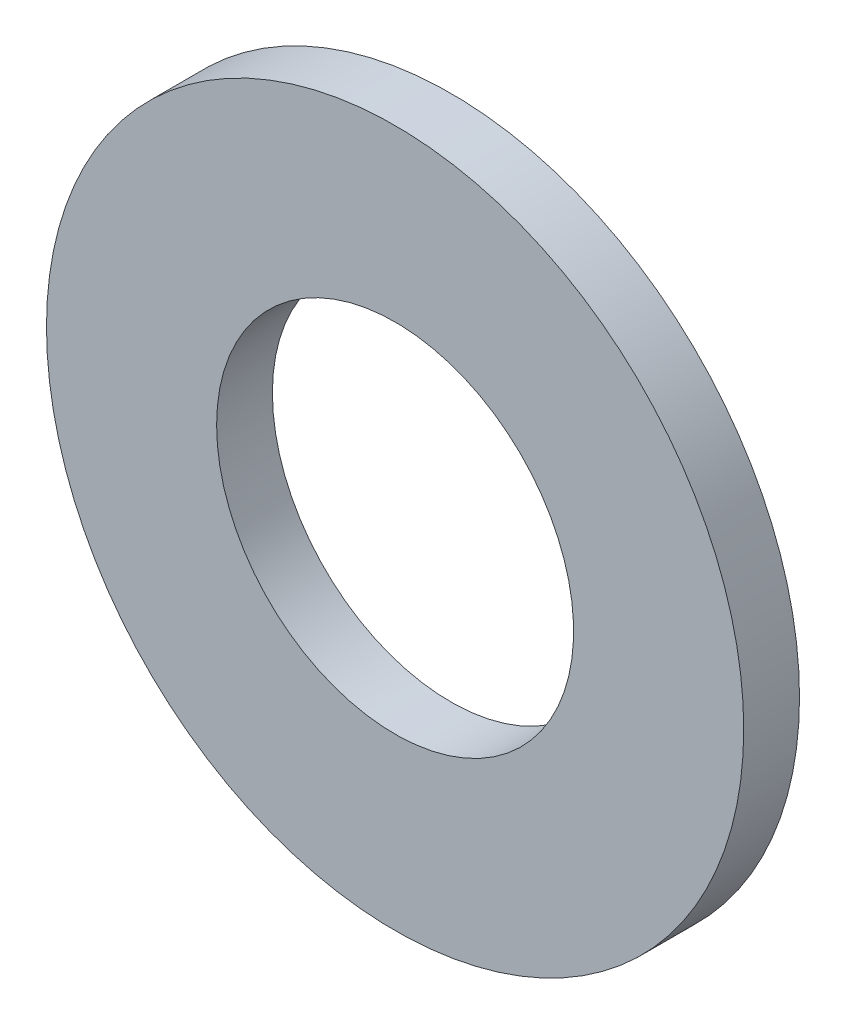
ISO-10303-21;
HEADER;
FILE_DESCRIPTION(('STEP AP214'),'2;1');
FILE_NAME('part.step','',(''),(''),'','','');
FILE_SCHEMA(('AUTOMOTIVE_DESIGN { 1 0 10303 214 1 1 1 1 }'));
ENDSEC;
DATA;
#1=APPLICATION_CONTEXT('core data for automotive mechanical design processes');
#2=APPLICATION_PROTOCOL_DEFINITION('international standard','automotive_design',2000,#1);
#3=PRODUCT_CONTEXT('',#1,'mechanical');
#4=PRODUCT('Part','Part','',(#3));
#5=PRODUCT_RELATED_PRODUCT_CATEGORY('part','',(#4));
#6=PRODUCT_DEFINITION_FORMATION('','',#4);
#7=PRODUCT_DEFINITION_CONTEXT('part definition',#1,'design');
#8=PRODUCT_DEFINITION('design','',#6,#7);
#9=PRODUCT_DEFINITION_SHAPE('','',#8);
#10=(LENGTH_UNIT() NAMED_UNIT(*) SI_UNIT(.MILLI.,.METRE.));
#11=(NAMED_UNIT(*) PLANE_ANGLE_UNIT() SI_UNIT($,.RADIAN.));
#12=(NAMED_UNIT(*) SI_UNIT($,.STERADIAN.) SOLID_ANGLE_UNIT());
#13=UNCERTAINTY_MEASURE_WITH_UNIT(LENGTH_MEASURE(1.E-05),#10,'distance_accuracy_value','');
#14=(GEOMETRIC_REPRESENTATION_CONTEXT(3) GLOBAL_UNCERTAINTY_ASSIGNED_CONTEXT((#13)) GLOBAL_UNIT_ASSIGNED_CONTEXT((#10,
#11,#12)) REPRESENTATION_CONTEXT('',''));
#15=CARTESIAN_POINT('',(0.,0.,0.));
#16=DIRECTION('',(0.,0.,1.));
#17=DIRECTION('',(1.,0.,0.));
#18=AXIS2_PLACEMENT_3D('',#15,#16,#17);
#19=CARTESIAN_POINT('',(0.,0.,1.));
#20=DIRECTION('',(0.,0.,0.999999999999998));
#21=DIRECTION('',(1.,0.,0.));
#22=AXIS2_PLACEMENT_3D('',#19,#20,#21);
#23=PLANE('',#22);
#24=CARTESIAN_POINT('',(0.,0.,1.));
#25=DIRECTION('',(0.,0.,0.999999999999998));
#26=DIRECTION('',(1.,0.,0.));
#27=AXIS2_PLACEMENT_3D('',#24,#25,#26);
#28=CIRCLE('',#27,6.25);
#29=CARTESIAN_POINT('',(-6.25,0.,0.999999999999998));
#30=VERTEX_POINT('',#29);
#31=EDGE_CURVE('E10',#30,#30,#28,.T.);
#32=ORIENTED_EDGE('',*,*,#31,.T.);
#33=EDGE_LOOP('',(#32));
#34=FACE_BOUND('',#33,.T.);
#35=CARTESIAN_POINT('',(0.,0.,1.));
#36=DIRECTION('',(0.,0.,0.999999999999998));
#37=DIRECTION('',(1.,0.,0.));
#38=AXIS2_PLACEMENT_3D('',#35,#36,#37);
#39=CIRCLE('',#38,3.2);
#40=CARTESIAN_POINT('',(-3.2,0.,0.999999999999999));
#41=VERTEX_POINT('',#40);
#42=EDGE_CURVE('E39',#41,#41,#39,.T.);
#43=ORIENTED_EDGE('',*,*,#42,.F.);
#44=EDGE_LOOP('',(#43));
#45=FACE_BOUND('',#44,.T.);
#46=ADVANCED_FACE('F28',(#34,#45),#23,.T.);
#47=CARTESIAN_POINT('',(0.,0.,0.));
#48=DIRECTION('',(0.,0.,0.999999999999998));
#49=DIRECTION('',(1.,0.,0.));
#50=AXIS2_PLACEMENT_3D('',#47,#48,#49);
#51=PLANE('',#50);
#52=CARTESIAN_POINT('',(0.,0.,0.));
#53=DIRECTION('',(0.,0.,0.999999999999998));
#54=DIRECTION('',(1.,0.,0.));
#55=AXIS2_PLACEMENT_3D('',#52,#53,#54);
#56=CIRCLE('',#55,6.25);
#57=CARTESIAN_POINT('',(-6.25,0.,0.));
#58=VERTEX_POINT('',#57);
#59=EDGE_CURVE('E32',#58,#58,#56,.T.);
#60=ORIENTED_EDGE('',*,*,#59,.F.);
#61=EDGE_LOOP('',(#60));
#62=FACE_BOUND('',#61,.T.);
#63=CARTESIAN_POINT('',(0.,0.,0.));
#64=DIRECTION('',(0.,0.,0.999999999999998));
#65=DIRECTION('',(1.,0.,0.));
#66=AXIS2_PLACEMENT_3D('',#63,#64,#65);
#67=CIRCLE('',#66,3.2);
#68=CARTESIAN_POINT('',(-3.2,0.,0.));
#69=VERTEX_POINT('',#68);
#70=EDGE_CURVE('E41',#69,#69,#67,.T.);
#71=ORIENTED_EDGE('',*,*,#70,.T.);
#72=EDGE_LOOP('',(#71));
#73=FACE_BOUND('',#72,.T.);
#74=ADVANCED_FACE('F51',(#62,#73),#51,.F.);
#75=CARTESIAN_POINT('',(0.,0.,1.));
#76=DIRECTION('',(0.,0.,-0.999999999999998));
#77=DIRECTION('',(-1.,0.,0.));
#78=AXIS2_PLACEMENT_3D('',#75,#76,#77);
#79=CYLINDRICAL_SURFACE('',#78,6.25);
#80=CARTESIAN_POINT('',(-6.25,0.,0.999999999999998));
#81=CARTESIAN_POINT('',(-6.25,0.,0.989583333333331));
#82=CARTESIAN_POINT('',(-6.25,0.,0.979166666666665));
#83=CARTESIAN_POINT('',(-6.25,0.,0.958333333333331));
#84=CARTESIAN_POINT('',(-6.25,0.,0.947916666666665));
#85=CARTESIAN_POINT('',(-6.25,0.,0.927083333333331));
#86=CARTESIAN_POINT('',(-6.25,0.,0.916666666666665));
#87=CARTESIAN_POINT('',(-6.25,0.,0.895833333333331));
#88=CARTESIAN_POINT('',(-6.25,0.,0.885416666666665));
#89=CARTESIAN_POINT('',(-6.25,0.,0.864583333333331));
#90=CARTESIAN_POINT('',(-6.25,0.,0.854166666666665));
#91=CARTESIAN_POINT('',(-6.25,0.,0.833333333333331));
#92=CARTESIAN_POINT('',(-6.25,0.,0.822916666666665));
#93=CARTESIAN_POINT('',(-6.25,0.,0.802083333333331));
#94=CARTESIAN_POINT('',(-6.25,0.,0.791666666666665));
#95=CARTESIAN_POINT('',(-6.25,0.,0.770833333333331));
#96=CARTESIAN_POINT('',(-6.25,0.,0.760416666666664));
#97=CARTESIAN_POINT('',(-6.25,0.,0.739583333333331));
#98=CARTESIAN_POINT('',(-6.25,0.,0.729166666666664));
#99=CARTESIAN_POINT('',(-6.25,0.,0.708333333333331));
#100=CARTESIAN_POINT('',(-6.25,0.,0.697916666666664));
#101=CARTESIAN_POINT('',(-6.25,0.,0.677083333333331));
#102=CARTESIAN_POINT('',(-6.25,0.,0.666666666666664));
#103=CARTESIAN_POINT('',(-6.25,0.,0.645833333333331));
#104=CARTESIAN_POINT('',(-6.25,0.,0.635416666666664));
#105=CARTESIAN_POINT('',(-6.25,0.,0.614583333333331));
#106=CARTESIAN_POINT('',(-6.25,0.,0.604166666666664));
#107=CARTESIAN_POINT('',(-6.25,0.,0.583333333333331));
#108=CARTESIAN_POINT('',(-6.25,0.,0.572916666666664));
#109=CARTESIAN_POINT('',(-6.25,0.,0.552083333333331));
#110=CARTESIAN_POINT('',(-6.25,0.,0.541666666666664));
#111=CARTESIAN_POINT('',(-6.25,0.,0.520833333333331));
#112=CARTESIAN_POINT('',(-6.25,0.,0.510416666666664));
#113=CARTESIAN_POINT('',(-6.25,0.,0.489583333333331));
#114=CARTESIAN_POINT('',(-6.25,0.,0.479166666666664));
#115=CARTESIAN_POINT('',(-6.25,0.,0.458333333333331));
#116=CARTESIAN_POINT('',(-6.25,0.,0.447916666666664));
#117=CARTESIAN_POINT('',(-6.25,0.,0.427083333333331));
#118=CARTESIAN_POINT('',(-6.25,0.,0.416666666666664));
#119=CARTESIAN_POINT('',(-6.25,0.,0.395833333333331));
#120=CARTESIAN_POINT('',(-6.25,0.,0.385416666666664));
#121=CARTESIAN_POINT('',(-6.25,0.,0.364583333333331));
#122=CARTESIAN_POINT('',(-6.25,0.,0.354166666666664));
#123=CARTESIAN_POINT('',(-6.25,0.,0.333333333333331));
#124=CARTESIAN_POINT('',(-6.25,0.,0.322916666666664));
#125=CARTESIAN_POINT('',(-6.25,0.,0.302083333333331));
#126=CARTESIAN_POINT('',(-6.25,0.,0.291666666666664));
#127=CARTESIAN_POINT('',(-6.25,0.,0.270833333333331));
#128=CARTESIAN_POINT('',(-6.25,0.,0.260416666666664));
#129=CARTESIAN_POINT('',(-6.25,0.,0.239583333333331));
#130=CARTESIAN_POINT('',(-6.25,0.,0.229166666666664));
#131=CARTESIAN_POINT('',(-6.25,0.,0.208333333333331));
#132=CARTESIAN_POINT('',(-6.25,0.,0.197916666666664));
#133=CARTESIAN_POINT('',(-6.25,0.,0.177083333333331));
#134=CARTESIAN_POINT('',(-6.25,0.,0.166666666666664));
#135=CARTESIAN_POINT('',(-6.25,0.,0.145833333333331));
#136=CARTESIAN_POINT('',(-6.25,0.,0.135416666666664));
#137=CARTESIAN_POINT('',(-6.25,0.,0.114583333333331));
#138=CARTESIAN_POINT('',(-6.25,0.,0.104166666666664));
#139=CARTESIAN_POINT('',(-6.25,0.,0.0833333333333306));
#140=CARTESIAN_POINT('',(-6.25,0.,0.0729166666666638));
#141=CARTESIAN_POINT('',(-6.25,0.,0.0520833333333305));
#142=CARTESIAN_POINT('',(-6.25,0.,0.0416666666666638));
#143=CARTESIAN_POINT('',(-6.25,0.,0.0208333333333305));
#144=CARTESIAN_POINT('',(-6.25,0.,0.0104166666666638));
#145=CARTESIAN_POINT('',(-6.25,0.,0.));
#146=B_SPLINE_CURVE_WITH_KNOTS('',3,(#80,#81,#82,#83,#84,#85,#86,#87,#88,#89,#90,#91,#92,#93,
#94,#95,#96,#97,#98,#99,#100,#101,#102,#103,#104,#105,#106,#107,#108,#109,#110,#111,#112,#113,
#114,#115,#116,#117,#118,#119,#120,#121,#122,#123,#124,#125,#126,#127,#128,#129,#130,#131,#132,
#133,#134,#135,#136,#137,#138,#139,#140,#141,#142,#143,#144,#145),.UNSPECIFIED.,.F.,.F.,(4,2,2,
2,2,2,2,2,2,2,2,2,2,2,2,2,2,2,2,2,2,2,2,2,2,2,2,2,2,2,2,2,4),(0.,0.0312500000000001,
0.0625000000000002,0.0937500000000002,0.125,0.15625,0.1875,0.21875,0.25,0.28125,0.3125,0.34375,
0.375,0.40625,0.4375,0.46875,0.500000000000001,0.53125,0.562500000000001,0.593750000000001,
0.625000000000001,0.656250000000001,0.687500000000001,0.718750000000001,0.750000000000001,
0.781250000000001,0.812500000000001,0.843750000000001,0.875000000000001,0.906250000000001,
0.937500000000001,0.968750000000001,1.),.UNSPECIFIED.);
#147=EDGE_CURVE('BSEAM30',#30,#58,#146,.T.);
#148=ORIENTED_EDGE('',*,*,#31,.F.);
#149=ORIENTED_EDGE('',*,*,#59,.T.);
#150=ORIENTED_EDGE('',*,*,#147,.T.);
#151=ORIENTED_EDGE('',*,*,#147,.F.);
#152=EDGE_LOOP('',(#148,#150,#149,#151));
#153=FACE_BOUND('',#152,.T.);
#154=ADVANCED_FACE('F30',(#153),#79,.T.);
#155=CARTESIAN_POINT('',(0.,0.,1.));
#156=DIRECTION('',(0.,0.,-0.999999999999998));
#157=DIRECTION('',(-1.,0.,0.));
#158=AXIS2_PLACEMENT_3D('',#155,#156,#157);
#159=CYLINDRICAL_SURFACE('',#158,3.2);
#160=CARTESIAN_POINT('',(-3.2,0.,0.999999999999999));
#161=CARTESIAN_POINT('',(-3.2,0.,0.989583333333333));
#162=CARTESIAN_POINT('',(-3.2,0.,0.979166666666666));
#163=CARTESIAN_POINT('',(-3.2,0.,0.958333333333333));
#164=CARTESIAN_POINT('',(-3.2,0.,0.947916666666666));
#165=CARTESIAN_POINT('',(-3.2,0.,0.927083333333333));
#166=CARTESIAN_POINT('',(-3.2,0.,0.916666666666666));
#167=CARTESIAN_POINT('',(-3.2,0.,0.895833333333333));
#168=CARTESIAN_POINT('',(-3.2,0.,0.885416666666666));
#169=CARTESIAN_POINT('',(-3.2,0.,0.864583333333333));
#170=CARTESIAN_POINT('',(-3.2,0.,0.854166666666666));
#171=CARTESIAN_POINT('',(-3.2,0.,0.833333333333333));
#172=CARTESIAN_POINT('',(-3.2,0.,0.822916666666666));
#173=CARTESIAN_POINT('',(-3.2,0.,0.802083333333333));
#174=CARTESIAN_POINT('',(-3.2,0.,0.791666666666666));
#175=CARTESIAN_POINT('',(-3.2,0.,0.770833333333333));
#176=CARTESIAN_POINT('',(-3.2,0.,0.760416666666666));
#177=CARTESIAN_POINT('',(-3.2,0.,0.739583333333333));
#178=CARTESIAN_POINT('',(-3.2,0.,0.729166666666666));
#179=CARTESIAN_POINT('',(-3.2,0.,0.708333333333332));
#180=CARTESIAN_POINT('',(-3.2,0.,0.697916666666666));
#181=CARTESIAN_POINT('',(-3.2,0.,0.677083333333332));
#182=CARTESIAN_POINT('',(-3.2,0.,0.666666666666666));
#183=CARTESIAN_POINT('',(-3.2,0.,0.645833333333332));
#184=CARTESIAN_POINT('',(-3.2,0.,0.635416666666666));
#185=CARTESIAN_POINT('',(-3.2,0.,0.614583333333332));
#186=CARTESIAN_POINT('',(-3.2,0.,0.604166666666666));
#187=CARTESIAN_POINT('',(-3.2,0.,0.583333333333332));
#188=CARTESIAN_POINT('',(-3.2,0.,0.572916666666666));
#189=CARTESIAN_POINT('',(-3.2,0.,0.552083333333332));
#190=CARTESIAN_POINT('',(-3.2,0.,0.541666666666666));
#191=CARTESIAN_POINT('',(-3.2,0.,0.520833333333332));
#192=CARTESIAN_POINT('',(-3.2,0.,0.510416666666666));
#193=CARTESIAN_POINT('',(-3.2,0.,0.489583333333332));
#194=CARTESIAN_POINT('',(-3.2,0.,0.479166666666666));
#195=CARTESIAN_POINT('',(-3.2,0.,0.458333333333332));
#196=CARTESIAN_POINT('',(-3.2,0.,0.447916666666666));
#197=CARTESIAN_POINT('',(-3.2,0.,0.427083333333332));
#198=CARTESIAN_POINT('',(-3.2,0.,0.416666666666666));
#199=CARTESIAN_POINT('',(-3.2,0.,0.395833333333332));
#200=CARTESIAN_POINT('',(-3.2,0.,0.385416666666666));
#201=CARTESIAN_POINT('',(-3.2,0.,0.364583333333332));
#202=CARTESIAN_POINT('',(-3.2,0.,0.354166666666666));
#203=CARTESIAN_POINT('',(-3.2,0.,0.333333333333332));
#204=CARTESIAN_POINT('',(-3.2,0.,0.322916666666666));
#205=CARTESIAN_POINT('',(-3.2,0.,0.302083333333332));
#206=CARTESIAN_POINT('',(-3.2,0.,0.291666666666666));
#207=CARTESIAN_POINT('',(-3.2,0.,0.270833333333332));
#208=CARTESIAN_POINT('',(-3.2,0.,0.260416666666665));
#209=CARTESIAN_POINT('',(-3.2,0.,0.239583333333332));
#210=CARTESIAN_POINT('',(-3.2,0.,0.229166666666666));
#211=CARTESIAN_POINT('',(-3.2,0.,0.208333333333332));
#212=CARTESIAN_POINT('',(-3.2,0.,0.197916666666665));
#213=CARTESIAN_POINT('',(-3.2,0.,0.177083333333332));
#214=CARTESIAN_POINT('',(-3.2,0.,0.166666666666665));
#215=CARTESIAN_POINT('',(-3.2,0.,0.145833333333332));
#216=CARTESIAN_POINT('',(-3.2,0.,0.135416666666665));
#217=CARTESIAN_POINT('',(-3.2,0.,0.114583333333332));
#218=CARTESIAN_POINT('',(-3.2,0.,0.104166666666665));
#219=CARTESIAN_POINT('',(-3.2,0.,0.0833333333333321));
#220=CARTESIAN_POINT('',(-3.2,0.,0.0729166666666654));
#221=CARTESIAN_POINT('',(-3.2,0.,0.052083333333332));
#222=CARTESIAN_POINT('',(-3.2,0.,0.0416666666666653));
#223=CARTESIAN_POINT('',(-3.2,0.,0.0208333333333319));
#224=CARTESIAN_POINT('',(-3.2,0.,0.0104166666666652));
#225=CARTESIAN_POINT('',(-3.2,0.,0.));
#226=B_SPLINE_CURVE_WITH_KNOTS('',3,(#160,#161,#162,#163,#164,#165,#166,#167,#168,#169,#170,
#171,#172,#173,#174,#175,#176,#177,#178,#179,#180,#181,#182,#183,#184,#185,#186,#187,#188,#189,
#190,#191,#192,#193,#194,#195,#196,#197,#198,#199,#200,#201,#202,#203,#204,#205,#206,#207,#208,
#209,#210,#211,#212,#213,#214,#215,#216,#217,#218,#219,#220,#221,#222,#223,#224,#225),
.UNSPECIFIED.,.F.,.F.,(4,2,2,2,2,2,2,2,2,2,2,2,2,2,2,2,2,2,2,2,2,2,2,2,2,2,2,2,2,2,2,2,4),(0.,
0.0312499999999999,0.0624999999999999,0.09375,0.125,0.15625,0.1875,0.21875,0.25,0.28125,0.3125,
0.34375,0.375,0.40625,0.4375,0.46875,0.5,0.53125,0.5625,0.59375,0.625,0.65625,0.687500000000001,
0.718750000000001,0.750000000000001,0.78125,0.812500000000001,0.843750000000001,
0.875000000000001,0.906250000000001,0.937500000000001,0.968750000000001,1.),.UNSPECIFIED.);
#227=EDGE_CURVE('BSEAM47',#41,#69,#226,.T.);
#228=ORIENTED_EDGE('',*,*,#42,.T.);
#229=ORIENTED_EDGE('',*,*,#70,.F.);
#230=ORIENTED_EDGE('',*,*,#227,.T.);
#231=ORIENTED_EDGE('',*,*,#227,.F.);
#232=EDGE_LOOP('',(#228,#230,#229,#231));
#233=FACE_BOUND('',#232,.T.);
#234=ADVANCED_FACE('F47',(#233),#159,.F.);
#235=CLOSED_SHELL('',(#46,#74,#154,#234));
#236=MANIFOLD_SOLID_BREP('B2',#235);
#237=ADVANCED_BREP_SHAPE_REPRESENTATION('',(#18,#236),#14);
#238=SHAPE_DEFINITION_REPRESENTATION(#9,#237);
ENDSEC;
END-ISO-10303-21;
